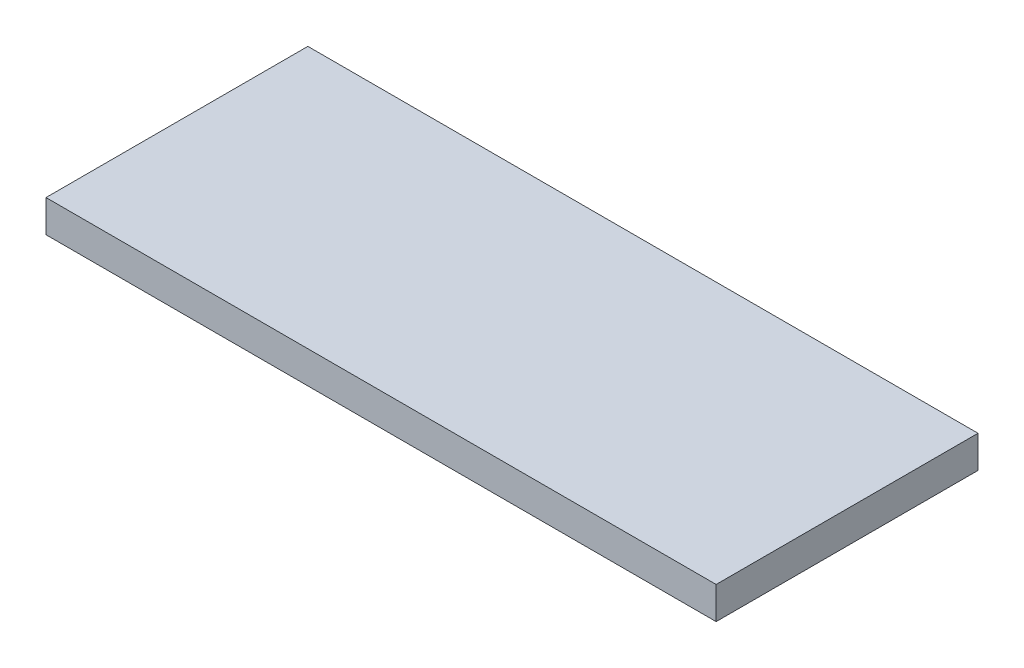
ISO-10303-21;
HEADER;
FILE_DESCRIPTION(('STEP AP214'),'2;1');
FILE_NAME('part.step','',(''),(''),'','','');
FILE_SCHEMA(('AUTOMOTIVE_DESIGN { 1 0 10303 214 1 1 1 1 }'));
ENDSEC;
DATA;
#1=APPLICATION_CONTEXT('core data for automotive mechanical design processes');
#2=APPLICATION_PROTOCOL_DEFINITION('international standard','automotive_design',2000,#1);
#3=PRODUCT_CONTEXT('',#1,'mechanical');
#4=PRODUCT('Part','Part','',(#3));
#5=PRODUCT_RELATED_PRODUCT_CATEGORY('part','',(#4));
#6=PRODUCT_DEFINITION_FORMATION('','',#4);
#7=PRODUCT_DEFINITION_CONTEXT('part definition',#1,'design');
#8=PRODUCT_DEFINITION('design','',#6,#7);
#9=PRODUCT_DEFINITION_SHAPE('','',#8);
#10=(LENGTH_UNIT() NAMED_UNIT(*) SI_UNIT(.MILLI.,.METRE.));
#11=(NAMED_UNIT(*) PLANE_ANGLE_UNIT() SI_UNIT($,.RADIAN.));
#12=(NAMED_UNIT(*) SI_UNIT($,.STERADIAN.) SOLID_ANGLE_UNIT());
#13=UNCERTAINTY_MEASURE_WITH_UNIT(LENGTH_MEASURE(1.E-05),#10,'distance_accuracy_value','');
#14=(GEOMETRIC_REPRESENTATION_CONTEXT(3) GLOBAL_UNCERTAINTY_ASSIGNED_CONTEXT((#13)) GLOBAL_UNIT_ASSIGNED_CONTEXT((#10,
#11,#12)) REPRESENTATION_CONTEXT('',''));
#15=CARTESIAN_POINT('',(0.,0.,0.));
#16=DIRECTION('',(0.,0.,1.));
#17=DIRECTION('',(1.,0.,0.));
#18=AXIS2_PLACEMENT_3D('',#15,#16,#17);
#19=CARTESIAN_POINT('',(32.5,3.125,12.7));
#20=DIRECTION('',(-1.,0.,0.));
#21=DIRECTION('',(0.,0.,1.));
#22=AXIS2_PLACEMENT_3D('',#19,#20,#21);
#23=PLANE('',#22);
#24=DIRECTION('',(0.,0.,-1.));
#25=VECTOR('',#24,1.);
#26=CARTESIAN_POINT('',(32.5,0.,12.7));
#27=LINE('',#26,#25);
#28=CARTESIAN_POINT('',(32.5,0.,12.7));
#29=VERTEX_POINT('',#28);
#30=CARTESIAN_POINT('',(32.5,0.,-12.7));
#31=VERTEX_POINT('',#30);
#32=EDGE_CURVE('E110',#29,#31,#27,.T.);
#33=ORIENTED_EDGE('',*,*,#32,.T.);
#34=DIRECTION('',(0.,-1.,0.));
#35=VECTOR('',#34,1.);
#36=CARTESIAN_POINT('',(32.5,3.125,-12.7));
#37=LINE('',#36,#35);
#38=CARTESIAN_POINT('',(32.5,3.125,-12.7));
#39=VERTEX_POINT('',#38);
#40=EDGE_CURVE('E11',#39,#31,#37,.T.);
#41=ORIENTED_EDGE('',*,*,#40,.F.);
#42=DIRECTION('',(0.,0.,-1.));
#43=VECTOR('',#42,1.);
#44=CARTESIAN_POINT('',(32.5,3.125,12.7));
#45=LINE('',#44,#43);
#46=CARTESIAN_POINT('',(32.5,3.125,12.7));
#47=VERTEX_POINT('',#46);
#48=EDGE_CURVE('E98',#47,#39,#45,.T.);
#49=ORIENTED_EDGE('',*,*,#48,.F.);
#50=DIRECTION('',(0.,-1.,0.));
#51=VECTOR('',#50,1.);
#52=CARTESIAN_POINT('',(32.5,3.125,12.7));
#53=LINE('',#52,#51);
#54=EDGE_CURVE('E106',#47,#29,#53,.T.);
#55=ORIENTED_EDGE('',*,*,#54,.T.);
#56=EDGE_LOOP('',(#33,#41,#49,#55));
#57=FACE_BOUND('',#56,.T.);
#58=ADVANCED_FACE('F47',(#57),#23,.F.);
#59=CARTESIAN_POINT('',(-32.5,3.125,-12.7));
#60=DIRECTION('',(0.,0.,1.));
#61=DIRECTION('',(1.,0.,0.));
#62=AXIS2_PLACEMENT_3D('',#59,#60,#61);
#63=PLANE('',#62);
#64=DIRECTION('',(-1.,0.,0.));
#65=VECTOR('',#64,1.);
#66=CARTESIAN_POINT('',(-32.5,0.,-12.7));
#67=LINE('',#66,#65);
#68=CARTESIAN_POINT('',(-32.5,0.,-12.7));
#69=VERTEX_POINT('',#68);
#70=EDGE_CURVE('E102',#31,#69,#67,.T.);
#71=ORIENTED_EDGE('',*,*,#70,.T.);
#72=DIRECTION('',(0.,-1.,0.));
#73=VECTOR('',#72,1.);
#74=CARTESIAN_POINT('',(-32.5,3.125,-12.7));
#75=LINE('',#74,#73);
#76=CARTESIAN_POINT('',(-32.5,3.125,-12.7));
#77=VERTEX_POINT('',#76);
#78=EDGE_CURVE('E55',#77,#69,#75,.T.);
#79=ORIENTED_EDGE('',*,*,#78,.F.);
#80=DIRECTION('',(-1.,0.,0.));
#81=VECTOR('',#80,1.);
#82=CARTESIAN_POINT('',(-32.5,3.125,-12.7));
#83=LINE('',#82,#81);
#84=EDGE_CURVE('E93',#39,#77,#83,.T.);
#85=ORIENTED_EDGE('',*,*,#84,.F.);
#86=ORIENTED_EDGE('',*,*,#40,.T.);
#87=EDGE_LOOP('',(#71,#79,#85,#86));
#88=FACE_BOUND('',#87,.T.);
#89=ADVANCED_FACE('F101',(#88),#63,.F.);
#90=CARTESIAN_POINT('',(-32.5,3.125,12.7));
#91=DIRECTION('',(1.,0.,0.));
#92=DIRECTION('',(0.,0.,-1.));
#93=AXIS2_PLACEMENT_3D('',#90,#91,#92);
#94=PLANE('',#93);
#95=DIRECTION('',(0.,0.,1.));
#96=VECTOR('',#95,1.);
#97=CARTESIAN_POINT('',(-32.5,0.,12.7));
#98=LINE('',#97,#96);
#99=CARTESIAN_POINT('',(-32.5,0.,12.7));
#100=VERTEX_POINT('',#99);
#101=EDGE_CURVE('E80',#69,#100,#98,.T.);
#102=ORIENTED_EDGE('',*,*,#101,.T.);
#103=DIRECTION('',(0.,-1.,0.));
#104=VECTOR('',#103,1.);
#105=CARTESIAN_POINT('',(-32.5,3.125,12.7));
#106=LINE('',#105,#104);
#107=CARTESIAN_POINT('',(-32.5,3.125,12.7));
#108=VERTEX_POINT('',#107);
#109=EDGE_CURVE('E103',#108,#100,#106,.T.);
#110=ORIENTED_EDGE('',*,*,#109,.F.);
#111=DIRECTION('',(0.,0.,1.));
#112=VECTOR('',#111,1.);
#113=CARTESIAN_POINT('',(-32.5,3.125,12.7));
#114=LINE('',#113,#112);
#115=EDGE_CURVE('E96',#77,#108,#114,.T.);
#116=ORIENTED_EDGE('',*,*,#115,.F.);
#117=ORIENTED_EDGE('',*,*,#78,.T.);
#118=EDGE_LOOP('',(#102,#110,#116,#117));
#119=FACE_BOUND('',#118,.T.);
#120=ADVANCED_FACE('F104',(#119),#94,.F.);
#121=CARTESIAN_POINT('',(-32.5,3.125,12.7));
#122=DIRECTION('',(0.,0.,-1.));
#123=DIRECTION('',(-1.,0.,0.));
#124=AXIS2_PLACEMENT_3D('',#121,#122,#123);
#125=PLANE('',#124);
#126=DIRECTION('',(1.,0.,0.));
#127=VECTOR('',#126,1.);
#128=CARTESIAN_POINT('',(-32.5,0.,12.7));
#129=LINE('',#128,#127);
#130=EDGE_CURVE('E86',#100,#29,#129,.T.);
#131=ORIENTED_EDGE('',*,*,#130,.T.);
#132=ORIENTED_EDGE('',*,*,#54,.F.);
#133=DIRECTION('',(1.,0.,0.));
#134=VECTOR('',#133,1.);
#135=CARTESIAN_POINT('',(-32.5,3.125,12.7));
#136=LINE('',#135,#134);
#137=EDGE_CURVE('E63',#108,#47,#136,.T.);
#138=ORIENTED_EDGE('',*,*,#137,.F.);
#139=ORIENTED_EDGE('',*,*,#109,.T.);
#140=EDGE_LOOP('',(#131,#132,#138,#139));
#141=FACE_BOUND('',#140,.T.);
#142=ADVANCED_FACE('F117',(#141),#125,.F.);
#143=CARTESIAN_POINT('',(0.,3.125,0.));
#144=DIRECTION('',(0.,-1.,0.));
#145=DIRECTION('',(0.,0.,-1.));
#146=AXIS2_PLACEMENT_3D('',#143,#144,#145);
#147=PLANE('',#146);
#148=ORIENTED_EDGE('',*,*,#48,.T.);
#149=ORIENTED_EDGE('',*,*,#84,.T.);
#150=ORIENTED_EDGE('',*,*,#115,.T.);
#151=ORIENTED_EDGE('',*,*,#137,.T.);
#152=EDGE_LOOP('',(#148,#149,#150,#151));
#153=FACE_BOUND('',#152,.T.);
#154=ADVANCED_FACE('F94',(#153),#147,.F.);
#155=CARTESIAN_POINT('',(0.,0.,0.));
#156=DIRECTION('',(0.,-1.,0.));
#157=DIRECTION('',(0.,0.,-1.));
#158=AXIS2_PLACEMENT_3D('',#155,#156,#157);
#159=PLANE('',#158);
#160=ORIENTED_EDGE('',*,*,#32,.F.);
#161=ORIENTED_EDGE('',*,*,#130,.F.);
#162=ORIENTED_EDGE('',*,*,#101,.F.);
#163=ORIENTED_EDGE('',*,*,#70,.F.);
#164=EDGE_LOOP('',(#160,#161,#162,#163));
#165=FACE_BOUND('',#164,.T.);
#166=ADVANCED_FACE('F120',(#165),#159,.T.);
#167=CLOSED_SHELL('',(#58,#89,#120,#142,#154,#166));
#168=MANIFOLD_SOLID_BREP('B2',#167);
#169=ADVANCED_BREP_SHAPE_REPRESENTATION('',(#18,#168),#14);
#170=SHAPE_DEFINITION_REPRESENTATION(#9,#169);
ENDSEC;
END-ISO-10303-21;
